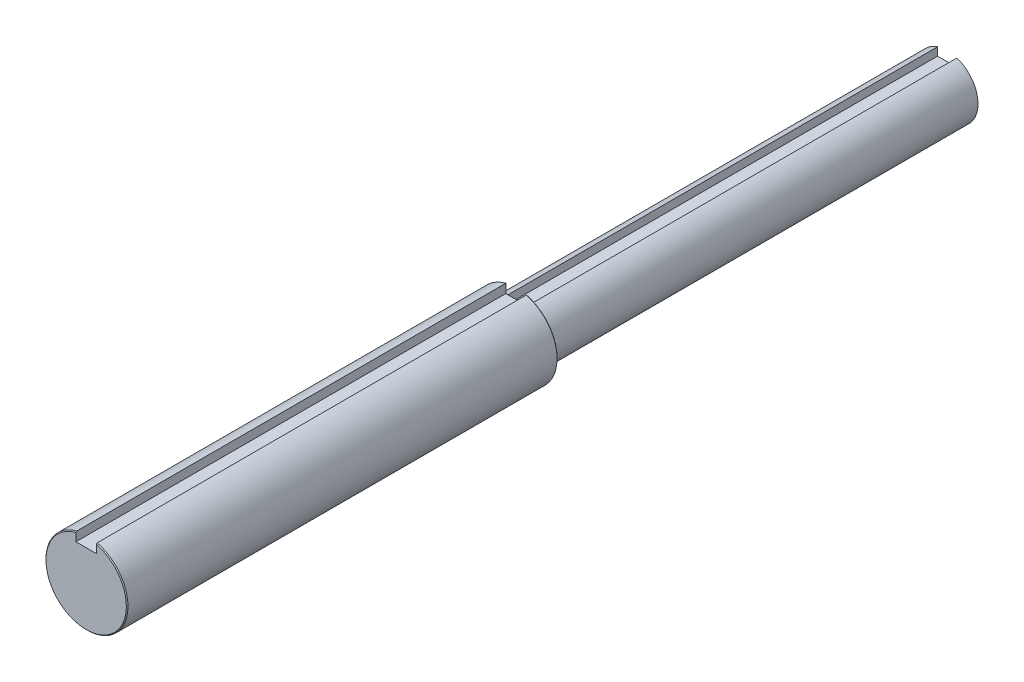
ISO-10303-21;
HEADER;
FILE_DESCRIPTION(('STEP AP214'),'2;1');
FILE_NAME('part.step','',(''),(''),'','','');
FILE_SCHEMA(('AUTOMOTIVE_DESIGN { 1 0 10303 214 1 1 1 1 }'));
ENDSEC;
DATA;
#1=APPLICATION_CONTEXT('core data for automotive mechanical design processes');
#2=APPLICATION_PROTOCOL_DEFINITION('international standard','automotive_design',2000,#1);
#3=PRODUCT_CONTEXT('',#1,'mechanical');
#4=PRODUCT('Part','Part','',(#3));
#5=PRODUCT_RELATED_PRODUCT_CATEGORY('part','',(#4));
#6=PRODUCT_DEFINITION_FORMATION('','',#4);
#7=PRODUCT_DEFINITION_CONTEXT('part definition',#1,'design');
#8=PRODUCT_DEFINITION('design','',#6,#7);
#9=PRODUCT_DEFINITION_SHAPE('','',#8);
#10=(LENGTH_UNIT() NAMED_UNIT(*) SI_UNIT(.MILLI.,.METRE.));
#11=(NAMED_UNIT(*) PLANE_ANGLE_UNIT() SI_UNIT($,.RADIAN.));
#12=(NAMED_UNIT(*) SI_UNIT($,.STERADIAN.) SOLID_ANGLE_UNIT());
#13=UNCERTAINTY_MEASURE_WITH_UNIT(LENGTH_MEASURE(1.E-05),#10,'distance_accuracy_value','');
#14=(GEOMETRIC_REPRESENTATION_CONTEXT(3) GLOBAL_UNCERTAINTY_ASSIGNED_CONTEXT((#13)) GLOBAL_UNIT_ASSIGNED_CONTEXT((#10,
#11,#12)) REPRESENTATION_CONTEXT('',''));
#15=CARTESIAN_POINT('',(0.,0.,0.));
#16=DIRECTION('',(0.,0.,1.));
#17=DIRECTION('',(1.,0.,0.));
#18=AXIS2_PLACEMENT_3D('',#15,#16,#17);
#19=CARTESIAN_POINT('',(0.,0.,304.8));
#20=DIRECTION('',(0.,0.,-1.));
#21=DIRECTION('',(-1.,0.,0.));
#22=AXIS2_PLACEMENT_3D('',#19,#20,#21);
#23=CYLINDRICAL_SURFACE('',#22,12.7);
#24=DIRECTION('',(0.,0.,-1.));
#25=VECTOR('',#24,1.);
#26=CARTESIAN_POINT('',(-3.175,12.2967221242085,304.8));
#27=LINE('',#26,#25);
#28=CARTESIAN_POINT('',(-3.175,12.2967221242085,304.546));
#29=VERTEX_POINT('',#28);
#30=CARTESIAN_POINT('',(-3.175,12.2967221242085,171.65));
#31=VERTEX_POINT('',#30);
#32=EDGE_CURVE('E186',#29,#31,#27,.T.);
#33=ORIENTED_EDGE('',*,*,#32,.T.);
#34=CARTESIAN_POINT('',(0.,0.,171.65));
#35=DIRECTION('',(0.,0.,1.));
#36=DIRECTION('',(1.,0.,0.));
#37=AXIS2_PLACEMENT_3D('',#34,#35,#36);
#38=CIRCLE('',#37,12.7);
#39=CARTESIAN_POINT('',(3.175,12.2967221242085,171.65));
#40=VERTEX_POINT('',#39);
#41=EDGE_CURVE('E58',#31,#40,#38,.T.);
#42=ORIENTED_EDGE('',*,*,#41,.T.);
#43=DIRECTION('',(0.,0.,-1.));
#44=VECTOR('',#43,1.);
#45=CARTESIAN_POINT('',(3.175,12.2967221242085,304.8));
#46=LINE('',#45,#44);
#47=CARTESIAN_POINT('',(3.175,12.2967221242085,304.546));
#48=VERTEX_POINT('',#47);
#49=EDGE_CURVE('E196',#48,#40,#46,.T.);
#50=ORIENTED_EDGE('',*,*,#49,.F.);
#51=CARTESIAN_POINT('',(0.,0.,304.546));
#52=DIRECTION('',(0.,0.,1.));
#53=DIRECTION('',(1.,0.,0.));
#54=AXIS2_PLACEMENT_3D('',#51,#52,#53);
#55=CIRCLE('',#54,12.7);
#56=EDGE_CURVE('E200',#48,#29,#55,.F.);
#57=ORIENTED_EDGE('',*,*,#56,.T.);
#58=EDGE_LOOP('',(#33,#42,#50,#57));
#59=FACE_BOUND('',#58,.T.);
#60=ADVANCED_FACE('F48',(#59),#23,.T.);
#61=CARTESIAN_POINT('',(3.175,9.52499999999995,304.8));
#62=DIRECTION('',(1.,0.,0.));
#63=DIRECTION('',(0.,0.,-1.));
#64=AXIS2_PLACEMENT_3D('',#61,#62,#63);
#65=PLANE('',#64);
#66=ORIENTED_EDGE('',*,*,#49,.T.);
#67=DIRECTION('',(0.,-1.,0.));
#68=VECTOR('',#67,1.);
#69=CARTESIAN_POINT('',(3.175,9.52499999999995,171.65));
#70=LINE('',#69,#68);
#71=CARTESIAN_POINT('',(3.175,9.52499999999995,171.65));
#72=VERTEX_POINT('',#71);
#73=EDGE_CURVE('E293',#40,#72,#70,.T.);
#74=ORIENTED_EDGE('',*,*,#73,.T.);
#75=DIRECTION('',(0.,0.,-1.));
#76=VECTOR('',#75,1.);
#77=CARTESIAN_POINT('',(3.175,9.52499999999995,304.8));
#78=LINE('',#77,#76);
#79=CARTESIAN_POINT('',(3.175,9.52499999999995,304.8));
#80=VERTEX_POINT('',#79);
#81=EDGE_CURVE('E192',#80,#72,#78,.T.);
#82=ORIENTED_EDGE('',*,*,#81,.F.);
#83=DIRECTION('',(0.,-1.,0.));
#84=VECTOR('',#83,1.);
#85=CARTESIAN_POINT('',(3.175,9.52499999999995,304.8));
#86=LINE('',#85,#84);
#87=CARTESIAN_POINT('',(3.175,12.0342133519396,304.8));
#88=VERTEX_POINT('',#87);
#89=EDGE_CURVE('E176',#88,#80,#86,.T.);
#90=ORIENTED_EDGE('',*,*,#89,.F.);
#91=CARTESIAN_POINT('',(3.175,12.0342133519396,304.8));
#92=CARTESIAN_POINT('',(3.175,12.0779793705573,304.757681710846));
#93=CARTESIAN_POINT('',(3.175,12.1217381108952,304.715355899595));
#94=CARTESIAN_POINT('',(3.175,12.2092410349848,304.630689232929));
#95=CARTESIAN_POINT('',(3.175,12.2529852187366,304.588348377512));
#96=CARTESIAN_POINT('',(3.175,12.2967221242085,304.546));
#97=B_SPLINE_CURVE_WITH_KNOTS('',3,(#91,#92,#93,#94,#95,#96),.UNSPECIFIED.,.F.,.F.,(4,2,4),(0.,
0.182638207627681,0.365276415146294),.UNSPECIFIED.);
#98=EDGE_CURVE('E203',#88,#48,#97,.T.);
#99=ORIENTED_EDGE('',*,*,#98,.T.);
#100=EDGE_LOOP('',(#66,#74,#82,#90,#99));
#101=FACE_BOUND('',#100,.T.);
#102=ADVANCED_FACE('F223',(#101),#65,.F.);
#103=CARTESIAN_POINT('',(3.175,9.52499999999995,304.8));
#104=DIRECTION('',(0.,-1.,0.));
#105=DIRECTION('',(0.,0.,-1.));
#106=AXIS2_PLACEMENT_3D('',#103,#104,#105);
#107=PLANE('',#106);
#108=ORIENTED_EDGE('',*,*,#81,.T.);
#109=DIRECTION('',(-1.,0.,0.));
#110=VECTOR('',#109,1.);
#111=CARTESIAN_POINT('',(3.175,9.52499999999995,171.65));
#112=LINE('',#111,#110);
#113=CARTESIAN_POINT('',(-3.175,9.52499999999995,171.65));
#114=VERTEX_POINT('',#113);
#115=EDGE_CURVE('E296',#72,#114,#112,.T.);
#116=ORIENTED_EDGE('',*,*,#115,.T.);
#117=DIRECTION('',(0.,0.,-1.));
#118=VECTOR('',#117,1.);
#119=CARTESIAN_POINT('',(-3.175,9.52499999999995,304.8));
#120=LINE('',#119,#118);
#121=CARTESIAN_POINT('',(-3.175,9.52499999999995,304.8));
#122=VERTEX_POINT('',#121);
#123=EDGE_CURVE('E189',#122,#114,#120,.T.);
#124=ORIENTED_EDGE('',*,*,#123,.F.);
#125=DIRECTION('',(-1.,0.,0.));
#126=VECTOR('',#125,1.);
#127=CARTESIAN_POINT('',(3.175,9.52499999999995,304.8));
#128=LINE('',#127,#126);
#129=EDGE_CURVE('E179',#80,#122,#128,.T.);
#130=ORIENTED_EDGE('',*,*,#129,.F.);
#131=EDGE_LOOP('',(#108,#116,#124,#130));
#132=FACE_BOUND('',#131,.T.);
#133=ADVANCED_FACE('F227',(#132),#107,.F.);
#134=CARTESIAN_POINT('',(-3.175,9.52499999999995,304.8));
#135=DIRECTION('',(-1.,0.,0.));
#136=DIRECTION('',(0.,0.,1.));
#137=AXIS2_PLACEMENT_3D('',#134,#135,#136);
#138=PLANE('',#137);
#139=ORIENTED_EDGE('',*,*,#123,.T.);
#140=DIRECTION('',(0.,1.,0.));
#141=VECTOR('',#140,1.);
#142=CARTESIAN_POINT('',(-3.175,9.52499999999995,171.65));
#143=LINE('',#142,#141);
#144=EDGE_CURVE('E72',#114,#31,#143,.T.);
#145=ORIENTED_EDGE('',*,*,#144,.T.);
#146=ORIENTED_EDGE('',*,*,#32,.F.);
#147=CARTESIAN_POINT('',(-3.175,12.2967221242085,304.546));
#148=CARTESIAN_POINT('',(-3.175,12.2529852187366,304.588348377512));
#149=CARTESIAN_POINT('',(-3.175,12.2092410349848,304.630689232929));
#150=CARTESIAN_POINT('',(-3.175,12.1217381108952,304.715355899595));
#151=CARTESIAN_POINT('',(-3.175,12.0779793705573,304.757681710846));
#152=CARTESIAN_POINT('',(-3.175,12.0342133519395,304.8));
#153=B_SPLINE_CURVE_WITH_KNOTS('',3,(#147,#148,#149,#150,#151,#152),.UNSPECIFIED.,.F.,.F.,(4,2,
4),(0.,0.182638207518613,0.365276415146298),.UNSPECIFIED.);
#154=CARTESIAN_POINT('',(-3.175,12.0342133519396,304.8));
#155=VERTEX_POINT('',#154);
#156=EDGE_CURVE('E212',#29,#155,#153,.T.);
#157=ORIENTED_EDGE('',*,*,#156,.T.);
#158=DIRECTION('',(0.,1.,0.));
#159=VECTOR('',#158,1.);
#160=CARTESIAN_POINT('',(-3.175,9.52499999999995,304.8));
#161=LINE('',#160,#159);
#162=EDGE_CURVE('E182',#122,#155,#161,.T.);
#163=ORIENTED_EDGE('',*,*,#162,.F.);
#164=EDGE_LOOP('',(#139,#145,#146,#157,#163));
#165=FACE_BOUND('',#164,.T.);
#166=ADVANCED_FACE('F393',(#165),#138,.F.);
#167=CARTESIAN_POINT('',(0.,0.,304.8));
#168=DIRECTION('',(0.,0.,1.));
#169=DIRECTION('',(1.,0.,0.));
#170=AXIS2_PLACEMENT_3D('',#167,#168,#169);
#171=PLANE('',#170);
#172=ORIENTED_EDGE('',*,*,#162,.T.);
#173=CARTESIAN_POINT('',(0.,0.,304.8));
#174=DIRECTION('',(0.,0.,1.));
#175=DIRECTION('',(1.,0.,0.));
#176=AXIS2_PLACEMENT_3D('',#173,#174,#175);
#177=CIRCLE('',#176,12.446);
#178=EDGE_CURVE('E360',#155,#88,#177,.T.);
#179=ORIENTED_EDGE('',*,*,#178,.T.);
#180=ORIENTED_EDGE('',*,*,#89,.T.);
#181=ORIENTED_EDGE('',*,*,#129,.T.);
#182=EDGE_LOOP('',(#172,#179,#180,#181));
#183=FACE_BOUND('',#182,.T.);
#184=ADVANCED_FACE('F396',(#183),#171,.T.);
#185=CARTESIAN_POINT('',(0.,0.,304.8));
#186=DIRECTION('',(0.,0.,-1.));
#187=DIRECTION('',(-1.,0.,0.));
#188=AXIS2_PLACEMENT_3D('',#185,#186,#187);
#189=CONICAL_SURFACE('',#188,12.446,0.785398163397377);
#190=ORIENTED_EDGE('',*,*,#156,.F.);
#191=ORIENTED_EDGE('',*,*,#56,.F.);
#192=ORIENTED_EDGE('',*,*,#98,.F.);
#193=ORIENTED_EDGE('',*,*,#178,.F.);
#194=EDGE_LOOP('',(#190,#191,#192,#193));
#195=FACE_BOUND('',#194,.T.);
#196=ADVANCED_FACE('F219',(#195),#189,.T.);
#197=CARTESIAN_POINT('',(0.,0.,171.45));
#198=DIRECTION('',(0.,0.,1.));
#199=DIRECTION('',(1.,0.,0.));
#200=AXIS2_PLACEMENT_3D('',#197,#198,#199);
#201=PLANE('',#200);
#202=DIRECTION('',(-1.,0.,0.));
#203=VECTOR('',#202,1.);
#204=CARTESIAN_POINT('',(-3.,6.72499999999999,171.45));
#205=LINE('',#204,#203);
#206=CARTESIAN_POINT('',(2.79999999999996,6.72499999999999,171.45));
#207=VERTEX_POINT('',#206);
#208=CARTESIAN_POINT('',(-2.79999999999996,6.72499999999999,171.45));
#209=VERTEX_POINT('',#208);
#210=EDGE_CURVE('E373',#207,#209,#205,.T.);
#211=ORIENTED_EDGE('',*,*,#210,.T.);
#212=DIRECTION('',(0.,1.,0.));
#213=VECTOR('',#212,1.);
#214=CARTESIAN_POINT('',(-2.79999999999996,9.04022261894031,171.45));
#215=LINE('',#214,#213);
#216=CARTESIAN_POINT('',(-2.79999999999996,9.31319628269481,171.45));
#217=VERTEX_POINT('',#216);
#218=EDGE_CURVE('E375',#209,#217,#215,.T.);
#219=ORIENTED_EDGE('',*,*,#218,.T.);
#220=CARTESIAN_POINT('',(0.,0.,171.45));
#221=DIRECTION('',(0.,0.,1.));
#222=DIRECTION('',(1.,0.,0.));
#223=AXIS2_PLACEMENT_3D('',#220,#221,#222);
#224=CIRCLE('',#223,9.72500000000001);
#225=CARTESIAN_POINT('',(2.79999999999996,9.31319628269481,171.45));
#226=VERTEX_POINT('',#225);
#227=EDGE_CURVE('E354',#217,#226,#224,.T.);
#228=ORIENTED_EDGE('',*,*,#227,.T.);
#229=DIRECTION('',(0.,-1.,0.));
#230=VECTOR('',#229,1.);
#231=CARTESIAN_POINT('',(2.79999999999996,6.52499999999995,171.45));
#232=LINE('',#231,#230);
#233=EDGE_CURVE('E371',#226,#207,#232,.T.);
#234=ORIENTED_EDGE('',*,*,#233,.T.);
#235=EDGE_LOOP('',(#211,#219,#228,#234));
#236=FACE_BOUND('',#235,.T.);
#237=DIRECTION('',(0.,-1.,0.));
#238=VECTOR('',#237,1.);
#239=CARTESIAN_POINT('',(-3.375,0.,171.45));
#240=LINE('',#239,#238);
#241=CARTESIAN_POINT('',(-3.375,12.0357540270645,171.45));
#242=VERTEX_POINT('',#241);
#243=CARTESIAN_POINT('',(-3.375,9.32499999999996,171.45));
#244=VERTEX_POINT('',#243);
#245=EDGE_CURVE('E254',#242,#244,#240,.T.);
#246=ORIENTED_EDGE('',*,*,#245,.T.);
#247=DIRECTION('',(1.,0.,0.));
#248=VECTOR('',#247,1.);
#249=CARTESIAN_POINT('',(0.,9.32499999999996,171.45));
#250=LINE('',#249,#248);
#251=CARTESIAN_POINT('',(3.375,9.32499999999996,171.45));
#252=VERTEX_POINT('',#251);
#253=EDGE_CURVE('E368',#244,#252,#250,.T.);
#254=ORIENTED_EDGE('',*,*,#253,.T.);
#255=DIRECTION('',(0.,1.,0.));
#256=VECTOR('',#255,1.);
#257=CARTESIAN_POINT('',(3.375,0.,171.45));
#258=LINE('',#257,#256);
#259=CARTESIAN_POINT('',(3.375,12.0357540270645,171.45));
#260=VERTEX_POINT('',#259);
#261=EDGE_CURVE('E291',#252,#260,#258,.T.);
#262=ORIENTED_EDGE('',*,*,#261,.T.);
#263=CARTESIAN_POINT('',(0.,0.,171.45));
#264=DIRECTION('',(0.,0.,1.));
#265=DIRECTION('',(1.,0.,0.));
#266=AXIS2_PLACEMENT_3D('',#263,#264,#265);
#267=CIRCLE('',#266,12.5);
#268=EDGE_CURVE('E359',#260,#242,#267,.F.);
#269=ORIENTED_EDGE('',*,*,#268,.T.);
#270=EDGE_LOOP('',(#246,#254,#262,#269));
#271=FACE_BOUND('',#270,.T.);
#272=ADVANCED_FACE('F385',(#236,#271),#201,.F.);
#273=CARTESIAN_POINT('',(0.,0.,-304.8));
#274=DIRECTION('',(0.,0.,1.));
#275=DIRECTION('',(1.,0.,0.));
#276=AXIS2_PLACEMENT_3D('',#273,#274,#275);
#277=CYLINDRICAL_SURFACE('',#276,9.525);
#278=CARTESIAN_POINT('',(0.,0.,38.1));
#279=DIRECTION('',(0.,0.,1.));
#280=DIRECTION('',(1.,0.,0.));
#281=AXIS2_PLACEMENT_3D('',#278,#279,#280);
#282=CIRCLE('',#281,9.525);
#283=CARTESIAN_POINT('',(3.,9.04022261894031,38.1));
#284=VERTEX_POINT('',#283);
#285=CARTESIAN_POINT('',(-3.,9.04022261894031,38.0999999999999));
#286=VERTEX_POINT('',#285);
#287=EDGE_CURVE('E65',#284,#286,#282,.F.);
#288=ORIENTED_EDGE('',*,*,#287,.F.);
#289=DIRECTION('',(0.,0.,1.));
#290=VECTOR('',#289,1.);
#291=CARTESIAN_POINT('',(3.,9.04022261894031,-304.8));
#292=LINE('',#291,#290);
#293=CARTESIAN_POINT('',(3.,9.04022261894031,171.25));
#294=VERTEX_POINT('',#293);
#295=EDGE_CURVE('E173',#294,#284,#292,.F.);
#296=ORIENTED_EDGE('',*,*,#295,.F.);
#297=CARTESIAN_POINT('',(0.,0.,171.25));
#298=DIRECTION('',(0.,0.,1.));
#299=DIRECTION('',(1.,0.,0.));
#300=AXIS2_PLACEMENT_3D('',#297,#298,#299);
#301=CIRCLE('',#300,9.525);
#302=CARTESIAN_POINT('',(-3.,9.04022261894031,171.25));
#303=VERTEX_POINT('',#302);
#304=EDGE_CURVE('E299',#294,#303,#301,.F.);
#305=ORIENTED_EDGE('',*,*,#304,.T.);
#306=DIRECTION('',(0.,0.,1.));
#307=VECTOR('',#306,1.);
#308=CARTESIAN_POINT('',(-3.,9.04022261894031,-304.8));
#309=LINE('',#308,#307);
#310=EDGE_CURVE('E165',#286,#303,#309,.T.);
#311=ORIENTED_EDGE('',*,*,#310,.F.);
#312=EDGE_LOOP('',(#288,#296,#305,#311));
#313=FACE_BOUND('',#312,.T.);
#314=ADVANCED_FACE('F346',(#313),#277,.T.);
#315=CARTESIAN_POINT('',(3.,12.525,-304.8));
#316=DIRECTION('',(1.,0.,0.));
#317=DIRECTION('',(0.,1.,0.));
#318=AXIS2_PLACEMENT_3D('',#315,#316,#317);
#319=PLANE('',#318);
#320=ORIENTED_EDGE('',*,*,#295,.T.);
#321=DIRECTION('',(0.,-1.,0.));
#322=VECTOR('',#321,1.);
#323=CARTESIAN_POINT('',(3.,12.525,38.1));
#324=LINE('',#323,#322);
#325=CARTESIAN_POINT('',(3.,6.52499999999995,38.1));
#326=VERTEX_POINT('',#325);
#327=EDGE_CURVE('E157',#284,#326,#324,.T.);
#328=ORIENTED_EDGE('',*,*,#327,.T.);
#329=DIRECTION('',(0.,0.,1.));
#330=VECTOR('',#329,1.);
#331=CARTESIAN_POINT('',(3.,6.52499999999995,-304.8));
#332=LINE('',#331,#330);
#333=CARTESIAN_POINT('',(3.,6.52499999999995,171.25));
#334=VERTEX_POINT('',#333);
#335=EDGE_CURVE('E156',#326,#334,#332,.T.);
#336=ORIENTED_EDGE('',*,*,#335,.T.);
#337=DIRECTION('',(0.,1.,0.));
#338=VECTOR('',#337,1.);
#339=CARTESIAN_POINT('',(3.,9.04022261894031,171.25));
#340=LINE('',#339,#338);
#341=EDGE_CURVE('E352',#334,#294,#340,.T.);
#342=ORIENTED_EDGE('',*,*,#341,.T.);
#343=EDGE_LOOP('',(#320,#328,#336,#342));
#344=FACE_BOUND('',#343,.T.);
#345=ADVANCED_FACE('F343',(#344),#319,.F.);
#346=CARTESIAN_POINT('',(-3.,6.52499999999995,-304.8));
#347=DIRECTION('',(0.,-1.,0.));
#348=DIRECTION('',(0.,0.,-1.));
#349=AXIS2_PLACEMENT_3D('',#346,#347,#348);
#350=PLANE('',#349);
#351=ORIENTED_EDGE('',*,*,#335,.F.);
#352=DIRECTION('',(-1.,0.,0.));
#353=VECTOR('',#352,1.);
#354=CARTESIAN_POINT('',(-3.,6.52499999999995,38.1));
#355=LINE('',#354,#353);
#356=CARTESIAN_POINT('',(-3.,6.52499999999995,38.1));
#357=VERTEX_POINT('',#356);
#358=EDGE_CURVE('E145',#326,#357,#355,.T.);
#359=ORIENTED_EDGE('',*,*,#358,.T.);
#360=DIRECTION('',(0.,0.,1.));
#361=VECTOR('',#360,1.);
#362=CARTESIAN_POINT('',(-3.,6.52499999999995,-304.8));
#363=LINE('',#362,#361);
#364=CARTESIAN_POINT('',(-3.,6.52499999999995,171.25));
#365=VERTEX_POINT('',#364);
#366=EDGE_CURVE('E154',#357,#365,#363,.T.);
#367=ORIENTED_EDGE('',*,*,#366,.T.);
#368=DIRECTION('',(1.,0.,0.));
#369=VECTOR('',#368,1.);
#370=CARTESIAN_POINT('',(3.,6.52499999999995,171.25));
#371=LINE('',#370,#369);
#372=EDGE_CURVE('E377',#365,#334,#371,.T.);
#373=ORIENTED_EDGE('',*,*,#372,.T.);
#374=EDGE_LOOP('',(#351,#359,#367,#373));
#375=FACE_BOUND('',#374,.T.);
#376=ADVANCED_FACE('F152',(#375),#350,.F.);
#377=CARTESIAN_POINT('',(-3.,12.525,-304.8));
#378=DIRECTION('',(-1.,0.,0.));
#379=DIRECTION('',(0.,-1.,0.));
#380=AXIS2_PLACEMENT_3D('',#377,#378,#379);
#381=PLANE('',#380);
#382=ORIENTED_EDGE('',*,*,#366,.F.);
#383=DIRECTION('',(0.,1.,0.));
#384=VECTOR('',#383,1.);
#385=CARTESIAN_POINT('',(-3.,12.525,38.1));
#386=LINE('',#385,#384);
#387=EDGE_CURVE('E11',#357,#286,#386,.T.);
#388=ORIENTED_EDGE('',*,*,#387,.T.);
#389=ORIENTED_EDGE('',*,*,#310,.T.);
#390=DIRECTION('',(0.,-1.,0.));
#391=VECTOR('',#390,1.);
#392=CARTESIAN_POINT('',(-3.,6.52499999999995,171.25));
#393=LINE('',#392,#391);
#394=EDGE_CURVE('E162',#303,#365,#393,.T.);
#395=ORIENTED_EDGE('',*,*,#394,.T.);
#396=EDGE_LOOP('',(#382,#388,#389,#395));
#397=FACE_BOUND('',#396,.T.);
#398=ADVANCED_FACE('F160',(#397),#381,.F.);
#399=CARTESIAN_POINT('',(3.,12.525,171.25));
#400=DIRECTION('',(-0.707106781186394,0.,-0.707106781186701));
#401=DIRECTION('',(0.,-1.,0.));
#402=AXIS2_PLACEMENT_3D('',#399,#400,#401);
#403=PLANE('',#402);
#404=DIRECTION('',(-0.57735026918971,0.577350269189709,0.577350269189459));
#405=VECTOR('',#404,1.);
#406=CARTESIAN_POINT('',(0.999999999999419,8.52500000000053,173.25));
#407=LINE('',#406,#405);
#408=EDGE_CURVE('E168',#207,#334,#407,.F.);
#409=ORIENTED_EDGE('',*,*,#408,.F.);
#410=ORIENTED_EDGE('',*,*,#233,.F.);
#411=CARTESIAN_POINT('',(3.,9.04022261894031,171.25));
#412=CARTESIAN_POINT('',(2.96690574453186,9.08606857413627,171.283094255468));
#413=CARTESIAN_POINT('',(2.93369194772278,9.13173936028566,171.316308052277));
#414=CARTESIAN_POINT('',(2.8670252809875,9.22273058143663,171.382974719012));
#415=CARTESIAN_POINT('',(2.8335724111299,9.26805101653874,171.41642758887));
#416=CARTESIAN_POINT('',(2.79999999999997,9.3131962826948,171.45));
#417=B_SPLINE_CURVE_WITH_KNOTS('',3,(#411,#412,#413,#414,#415,#416),.UNSPECIFIED.,.F.,.F.,(4,2,
4),(0.,0.196543124377538,0.39308619235849),.UNSPECIFIED.);
#418=EDGE_CURVE('E163',#294,#226,#417,.T.);
#419=ORIENTED_EDGE('',*,*,#418,.F.);
#420=ORIENTED_EDGE('',*,*,#341,.F.);
#421=EDGE_LOOP('',(#409,#410,#419,#420));
#422=FACE_BOUND('',#421,.T.);
#423=ADVANCED_FACE('F329',(#422),#403,.T.);
#424=CARTESIAN_POINT('',(0.,0.,171.45));
#425=DIRECTION('',(0.,0.,1.));
#426=DIRECTION('',(1.,0.,0.));
#427=AXIS2_PLACEMENT_3D('',#424,#425,#426);
#428=CONICAL_SURFACE('',#427,9.72500000000004,0.785398163397596);
#429=ORIENTED_EDGE('',*,*,#418,.T.);
#430=ORIENTED_EDGE('',*,*,#227,.F.);
#431=CARTESIAN_POINT('',(-2.79999999999996,9.31319628269481,171.45));
#432=CARTESIAN_POINT('',(-2.83357241112989,9.26805101653875,171.41642758887));
#433=CARTESIAN_POINT('',(-2.86702528098749,9.22273058143663,171.382974719012));
#434=CARTESIAN_POINT('',(-2.93369194772278,9.13173936028565,171.316308052277));
#435=CARTESIAN_POINT('',(-2.96690574453187,9.08606857413626,171.283094255468));
#436=CARTESIAN_POINT('',(-3.00000000000003,9.04022261894028,171.25));
#437=B_SPLINE_CURVE_WITH_KNOTS('',3,(#431,#432,#433,#434,#435,#436),.UNSPECIFIED.,.F.,.F.,(4,2,
4),(0.,0.19654306798096,0.393086192358494),.UNSPECIFIED.);
#438=EDGE_CURVE('E304',#303,#217,#437,.F.);
#439=ORIENTED_EDGE('',*,*,#438,.F.);
#440=ORIENTED_EDGE('',*,*,#304,.F.);
#441=EDGE_LOOP('',(#429,#430,#439,#440));
#442=FACE_BOUND('',#441,.T.);
#443=ADVANCED_FACE('F312',(#442),#428,.T.);
#444=CARTESIAN_POINT('',(-3.,6.52499999999995,171.25));
#445=DIRECTION('',(0.,0.707106781186394,-0.707106781186701));
#446=DIRECTION('',(-1.,0.,0.));
#447=AXIS2_PLACEMENT_3D('',#444,#445,#446);
#448=PLANE('',#447);
#449=ORIENTED_EDGE('',*,*,#408,.T.);
#450=ORIENTED_EDGE('',*,*,#372,.F.);
#451=DIRECTION('',(0.577350269189709,0.577350269189709,0.577350269189459));
#452=VECTOR('',#451,1.);
#453=CARTESIAN_POINT('',(-0.999999999999422,8.52500000000053,173.25));
#454=LINE('',#453,#452);
#455=EDGE_CURVE('E257',#209,#365,#454,.F.);
#456=ORIENTED_EDGE('',*,*,#455,.F.);
#457=ORIENTED_EDGE('',*,*,#210,.F.);
#458=EDGE_LOOP('',(#449,#450,#456,#457));
#459=FACE_BOUND('',#458,.T.);
#460=ADVANCED_FACE('F321',(#459),#448,.T.);
#461=CARTESIAN_POINT('',(-3.,12.525,171.25));
#462=DIRECTION('',(0.707106781186394,0.,-0.707106781186701));
#463=DIRECTION('',(0.,1.,0.));
#464=AXIS2_PLACEMENT_3D('',#461,#462,#463);
#465=PLANE('',#464);
#466=ORIENTED_EDGE('',*,*,#438,.T.);
#467=ORIENTED_EDGE('',*,*,#218,.F.);
#468=ORIENTED_EDGE('',*,*,#455,.T.);
#469=ORIENTED_EDGE('',*,*,#394,.F.);
#470=EDGE_LOOP('',(#466,#467,#468,#469));
#471=FACE_BOUND('',#470,.T.);
#472=ADVANCED_FACE('F288',(#471),#465,.T.);
#473=CARTESIAN_POINT('',(0.,0.,171.65));
#474=DIRECTION('',(0.,0.,1.));
#475=DIRECTION('',(1.,0.,0.));
#476=AXIS2_PLACEMENT_3D('',#473,#474,#475);
#477=CONICAL_SURFACE('',#476,12.7,0.785398163397357);
#478=CARTESIAN_POINT('',(-3.175,12.2967221242085,171.65));
#479=CARTESIAN_POINT('',(-3.20849772459394,12.253479418142,171.616502275406));
#480=CARTESIAN_POINT('',(-3.24191325261739,12.2101107249201,171.583086747383));
#481=CARTESIAN_POINT('',(-3.30857991930269,12.123121359234,171.516420080697));
#482=CARTESIAN_POINT('',(-3.34183105794591,12.0795006867412,171.483168942054));
#483=CARTESIAN_POINT('',(-3.37499999999999,12.0357540270645,171.45));
#484=B_SPLINE_CURVE_WITH_KNOTS('',3,(#478,#479,#480,#481,#482,#483),.UNSPECIFIED.,.F.,.F.,(4,2,
4),(0.,0.192422314718215,0.3848446512537),.UNSPECIFIED.);
#485=EDGE_CURVE('E244',#242,#31,#484,.F.);
#486=ORIENTED_EDGE('',*,*,#485,.F.);
#487=ORIENTED_EDGE('',*,*,#268,.F.);
#488=CARTESIAN_POINT('',(3.375,12.0357540270645,171.45));
#489=CARTESIAN_POINT('',(3.34183105794591,12.0795006867412,171.483168942054));
#490=CARTESIAN_POINT('',(3.30857991930269,12.123121359234,171.516420080697));
#491=CARTESIAN_POINT('',(3.24191325261739,12.2101107249201,171.583086747383));
#492=CARTESIAN_POINT('',(3.20849772459394,12.253479418142,171.616502275406));
#493=CARTESIAN_POINT('',(3.175,12.2967221242085,171.65));
#494=B_SPLINE_CURVE_WITH_KNOTS('',3,(#488,#489,#490,#491,#492,#493),.UNSPECIFIED.,.F.,.F.,(4,2,
4),(0.,0.192422336535488,0.384844651253706),.UNSPECIFIED.);
#495=EDGE_CURVE('E247',#40,#260,#494,.F.);
#496=ORIENTED_EDGE('',*,*,#495,.F.);
#497=ORIENTED_EDGE('',*,*,#41,.F.);
#498=EDGE_LOOP('',(#486,#487,#496,#497));
#499=FACE_BOUND('',#498,.T.);
#500=ADVANCED_FACE('F242',(#499),#477,.T.);
#501=CARTESIAN_POINT('',(3.175,9.52499999999995,171.65));
#502=DIRECTION('',(0.707106781186612,0.,0.707106781186483));
#503=DIRECTION('',(0.,-1.,0.));
#504=AXIS2_PLACEMENT_3D('',#501,#502,#503);
#505=PLANE('',#504);
#506=ORIENTED_EDGE('',*,*,#495,.T.);
#507=ORIENTED_EDGE('',*,*,#261,.F.);
#508=DIRECTION('',(-0.577350269189591,0.577350269189591,0.577350269189696));
#509=VECTOR('',#508,1.);
#510=CARTESIAN_POINT('',(3.175,9.52499999999995,171.65));
#511=LINE('',#510,#509);
#512=EDGE_CURVE('E255',#72,#252,#511,.F.);
#513=ORIENTED_EDGE('',*,*,#512,.F.);
#514=ORIENTED_EDGE('',*,*,#73,.F.);
#515=EDGE_LOOP('',(#506,#507,#513,#514));
#516=FACE_BOUND('',#515,.T.);
#517=ADVANCED_FACE('F51',(#516),#505,.F.);
#518=CARTESIAN_POINT('',(-3.175,9.52499999999995,171.65));
#519=DIRECTION('',(-0.707106781186612,0.,0.707106781186483));
#520=DIRECTION('',(0.,1.,0.));
#521=AXIS2_PLACEMENT_3D('',#518,#519,#520);
#522=PLANE('',#521);
#523=ORIENTED_EDGE('',*,*,#485,.T.);
#524=ORIENTED_EDGE('',*,*,#144,.F.);
#525=DIRECTION('',(-0.577350269189591,-0.577350269189591,-0.577350269189696));
#526=VECTOR('',#525,1.);
#527=CARTESIAN_POINT('',(-1.05833333333359,11.6416666666664,173.766666666667));
#528=LINE('',#527,#526);
#529=EDGE_CURVE('E258',#244,#114,#528,.F.);
#530=ORIENTED_EDGE('',*,*,#529,.F.);
#531=ORIENTED_EDGE('',*,*,#245,.F.);
#532=EDGE_LOOP('',(#523,#524,#530,#531));
#533=FACE_BOUND('',#532,.T.);
#534=ADVANCED_FACE('F251',(#533),#522,.F.);
#535=CARTESIAN_POINT('',(3.175,9.52499999999995,171.65));
#536=DIRECTION('',(0.,-0.707106781186612,0.707106781186483));
#537=DIRECTION('',(-1.,0.,0.));
#538=AXIS2_PLACEMENT_3D('',#535,#536,#537);
#539=PLANE('',#538);
#540=ORIENTED_EDGE('',*,*,#512,.T.);
#541=ORIENTED_EDGE('',*,*,#253,.F.);
#542=ORIENTED_EDGE('',*,*,#529,.T.);
#543=ORIENTED_EDGE('',*,*,#115,.F.);
#544=EDGE_LOOP('',(#540,#541,#542,#543));
#545=FACE_BOUND('',#544,.T.);
#546=ADVANCED_FACE('F278',(#545),#539,.F.);
#547=CARTESIAN_POINT('',(0.,0.,38.1));
#548=DIRECTION('',(0.,0.,1.));
#549=DIRECTION('',(1.,0.,0.));
#550=AXIS2_PLACEMENT_3D('',#547,#548,#549);
#551=PLANE('',#550);
#552=ORIENTED_EDGE('',*,*,#287,.T.);
#553=ORIENTED_EDGE('',*,*,#387,.F.);
#554=ORIENTED_EDGE('',*,*,#358,.F.);
#555=ORIENTED_EDGE('',*,*,#327,.F.);
#556=EDGE_LOOP('',(#552,#553,#554,#555));
#557=FACE_BOUND('',#556,.T.);
#558=ADVANCED_FACE('F144',(#557),#551,.F.);
#559=CLOSED_SHELL('',(#60,#102,#133,#166,#184,#196,#272,#314,#345,#376,#398,#423,#443,#460,#472,
#500,#517,#534,#546,#558));
#560=MANIFOLD_SOLID_BREP('B2',#559);
#561=ADVANCED_BREP_SHAPE_REPRESENTATION('',(#18,#560),#14);
#562=SHAPE_DEFINITION_REPRESENTATION(#9,#561);
ENDSEC;
END-ISO-10303-21;
